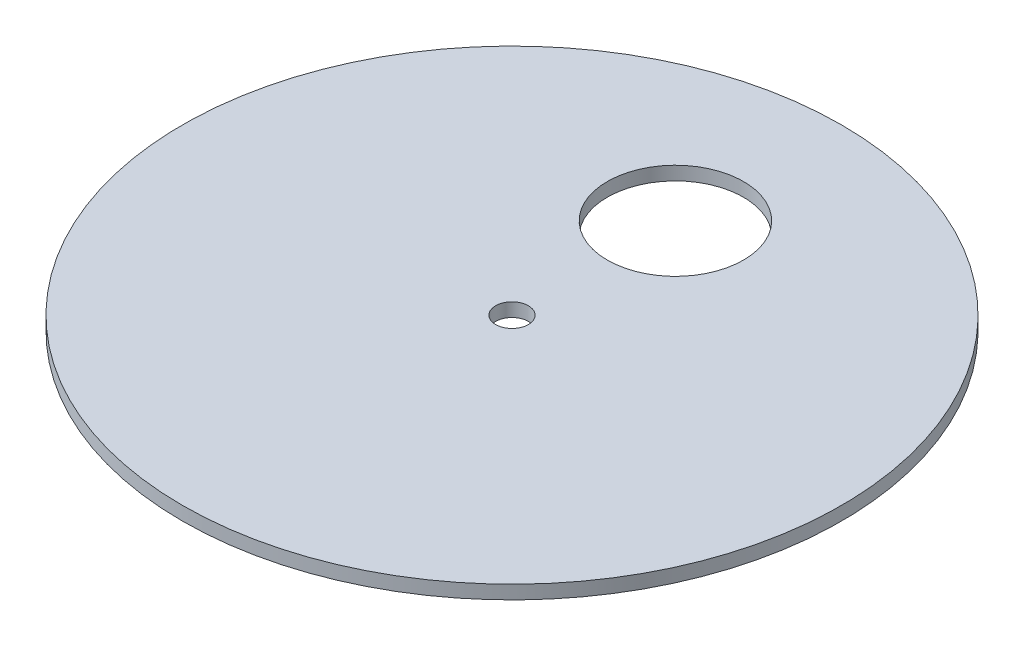
ISO-10303-21;
HEADER;
FILE_DESCRIPTION(('STEP AP214'),'2;1');
FILE_NAME('part.step','',(''),(''),'','','');
FILE_SCHEMA(('AUTOMOTIVE_DESIGN { 1 0 10303 214 1 1 1 1 }'));
ENDSEC;
DATA;
#1=APPLICATION_CONTEXT('core data for automotive mechanical design processes');
#2=APPLICATION_PROTOCOL_DEFINITION('international standard','automotive_design',2000,#1);
#3=PRODUCT_CONTEXT('',#1,'mechanical');
#4=PRODUCT('Part','Part','',(#3));
#5=PRODUCT_RELATED_PRODUCT_CATEGORY('part','',(#4));
#6=PRODUCT_DEFINITION_FORMATION('','',#4);
#7=PRODUCT_DEFINITION_CONTEXT('part definition',#1,'design');
#8=PRODUCT_DEFINITION('design','',#6,#7);
#9=PRODUCT_DEFINITION_SHAPE('','',#8);
#10=(LENGTH_UNIT() NAMED_UNIT(*) SI_UNIT(.MILLI.,.METRE.));
#11=(NAMED_UNIT(*) PLANE_ANGLE_UNIT() SI_UNIT($,.RADIAN.));
#12=(NAMED_UNIT(*) SI_UNIT($,.STERADIAN.) SOLID_ANGLE_UNIT());
#13=UNCERTAINTY_MEASURE_WITH_UNIT(LENGTH_MEASURE(1.E-05),#10,'distance_accuracy_value','');
#14=(GEOMETRIC_REPRESENTATION_CONTEXT(3) GLOBAL_UNCERTAINTY_ASSIGNED_CONTEXT((#13)) GLOBAL_UNIT_ASSIGNED_CONTEXT((#10,
#11,#12)) REPRESENTATION_CONTEXT('',''));
#15=CARTESIAN_POINT('',(0.,0.,0.));
#16=DIRECTION('',(0.,0.,1.));
#17=DIRECTION('',(1.,0.,0.));
#18=AXIS2_PLACEMENT_3D('',#15,#16,#17);
#19=CARTESIAN_POINT('',(0.,5.,0.));
#20=DIRECTION('',(0.,1.,0.));
#21=DIRECTION('',(0.,0.,1.));
#22=AXIS2_PLACEMENT_3D('',#19,#20,#21);
#23=PLANE('',#22);
#24=CARTESIAN_POINT('',(0.,5.,0.));
#25=DIRECTION('',(0.,1.,0.));
#26=DIRECTION('',(0.,0.,1.));
#27=AXIS2_PLACEMENT_3D('',#24,#25,#26);
#28=CIRCLE('',#27,6.);
#29=CARTESIAN_POINT('',(0.,5.,6.));
#30=VERTEX_POINT('',#29);
#31=EDGE_CURVE('E42',#30,#30,#28,.T.);
#32=ORIENTED_EDGE('',*,*,#31,.F.);
#33=EDGE_LOOP('',(#32));
#34=FACE_BOUND('',#33,.T.);
#35=CARTESIAN_POINT('',(0.,5.,0.));
#36=DIRECTION('',(0.,1.,0.));
#37=DIRECTION('',(0.,0.,1.));
#38=AXIS2_PLACEMENT_3D('',#35,#36,#37);
#39=CIRCLE('',#38,121.);
#40=CARTESIAN_POINT('',(0.,5.,121.));
#41=VERTEX_POINT('',#40);
#42=EDGE_CURVE('E10',#41,#41,#39,.T.);
#43=ORIENTED_EDGE('',*,*,#42,.T.);
#44=EDGE_LOOP('',(#43));
#45=FACE_BOUND('',#44,.T.);
#46=CARTESIAN_POINT('',(0.,5.,-60.));
#47=DIRECTION('',(0.,1.,0.));
#48=DIRECTION('',(0.,0.,1.));
#49=AXIS2_PLACEMENT_3D('',#46,#47,#48);
#50=CIRCLE('',#49,25.);
#51=CARTESIAN_POINT('',(0.,5.,-35.));
#52=VERTEX_POINT('',#51);
#53=EDGE_CURVE('E47',#52,#52,#50,.T.);
#54=ORIENTED_EDGE('',*,*,#53,.F.);
#55=EDGE_LOOP('',(#54));
#56=FACE_BOUND('',#55,.T.);
#57=ADVANCED_FACE('F31',(#34,#45,#56),#23,.T.);
#58=CARTESIAN_POINT('',(0.,0.,0.));
#59=DIRECTION('',(0.,1.,0.));
#60=DIRECTION('',(0.,0.,1.));
#61=AXIS2_PLACEMENT_3D('',#58,#59,#60);
#62=PLANE('',#61);
#63=CARTESIAN_POINT('',(0.,0.,0.));
#64=DIRECTION('',(0.,1.,0.));
#65=DIRECTION('',(0.,0.,1.));
#66=AXIS2_PLACEMENT_3D('',#63,#64,#65);
#67=CIRCLE('',#66,121.);
#68=CARTESIAN_POINT('',(0.,0.,121.));
#69=VERTEX_POINT('',#68);
#70=EDGE_CURVE('E35',#69,#69,#67,.T.);
#71=ORIENTED_EDGE('',*,*,#70,.F.);
#72=EDGE_LOOP('',(#71));
#73=FACE_BOUND('',#72,.T.);
#74=CARTESIAN_POINT('',(0.,0.,0.));
#75=DIRECTION('',(0.,1.,0.));
#76=DIRECTION('',(0.,0.,1.));
#77=AXIS2_PLACEMENT_3D('',#74,#75,#76);
#78=CIRCLE('',#77,6.);
#79=CARTESIAN_POINT('',(0.,0.,6.));
#80=VERTEX_POINT('',#79);
#81=EDGE_CURVE('E44',#80,#80,#78,.T.);
#82=ORIENTED_EDGE('',*,*,#81,.T.);
#83=EDGE_LOOP('',(#82));
#84=FACE_BOUND('',#83,.T.);
#85=CARTESIAN_POINT('',(0.,0.,-60.));
#86=DIRECTION('',(0.,1.,0.));
#87=DIRECTION('',(0.,0.,1.));
#88=AXIS2_PLACEMENT_3D('',#85,#86,#87);
#89=CIRCLE('',#88,25.);
#90=CARTESIAN_POINT('',(0.,0.,-35.));
#91=VERTEX_POINT('',#90);
#92=EDGE_CURVE('E50',#91,#91,#89,.T.);
#93=ORIENTED_EDGE('',*,*,#92,.T.);
#94=EDGE_LOOP('',(#93));
#95=FACE_BOUND('',#94,.T.);
#96=ADVANCED_FACE('F60',(#73,#84,#95),#62,.F.);
#97=CARTESIAN_POINT('',(0.,5.,0.));
#98=DIRECTION('',(0.,-1.,0.));
#99=DIRECTION('',(0.,0.,-1.));
#100=AXIS2_PLACEMENT_3D('',#97,#98,#99);
#101=CYLINDRICAL_SURFACE('',#100,121.);
#102=ORIENTED_EDGE('',*,*,#42,.F.);
#103=EDGE_LOOP('',(#102));
#104=FACE_BOUND('',#103,.T.);
#105=ORIENTED_EDGE('',*,*,#70,.T.);
#106=EDGE_LOOP('',(#105));
#107=FACE_BOUND('',#106,.T.);
#108=ADVANCED_FACE('F33',(#104,#107),#101,.T.);
#109=CARTESIAN_POINT('',(0.,5.,0.));
#110=DIRECTION('',(0.,-1.,0.));
#111=DIRECTION('',(0.,0.,-1.));
#112=AXIS2_PLACEMENT_3D('',#109,#110,#111);
#113=CYLINDRICAL_SURFACE('',#112,6.);
#114=ORIENTED_EDGE('',*,*,#31,.T.);
#115=EDGE_LOOP('',(#114));
#116=FACE_BOUND('',#115,.T.);
#117=ORIENTED_EDGE('',*,*,#81,.F.);
#118=EDGE_LOOP('',(#117));
#119=FACE_BOUND('',#118,.T.);
#120=ADVANCED_FACE('F69',(#116,#119),#113,.F.);
#121=CARTESIAN_POINT('',(0.,5.,-60.));
#122=DIRECTION('',(0.,-1.,0.));
#123=DIRECTION('',(0.,0.,-1.));
#124=AXIS2_PLACEMENT_3D('',#121,#122,#123);
#125=CYLINDRICAL_SURFACE('',#124,25.);
#126=ORIENTED_EDGE('',*,*,#53,.T.);
#127=EDGE_LOOP('',(#126));
#128=FACE_BOUND('',#127,.T.);
#129=ORIENTED_EDGE('',*,*,#92,.F.);
#130=EDGE_LOOP('',(#129));
#131=FACE_BOUND('',#130,.T.);
#132=ADVANCED_FACE('F56',(#128,#131),#125,.F.);
#133=CLOSED_SHELL('',(#57,#96,#108,#120,#132));
#134=MANIFOLD_SOLID_BREP('B2',#133);
#135=ADVANCED_BREP_SHAPE_REPRESENTATION('',(#18,#134),#14);
#136=SHAPE_DEFINITION_REPRESENTATION(#9,#135);
ENDSEC;
END-ISO-10303-21;
